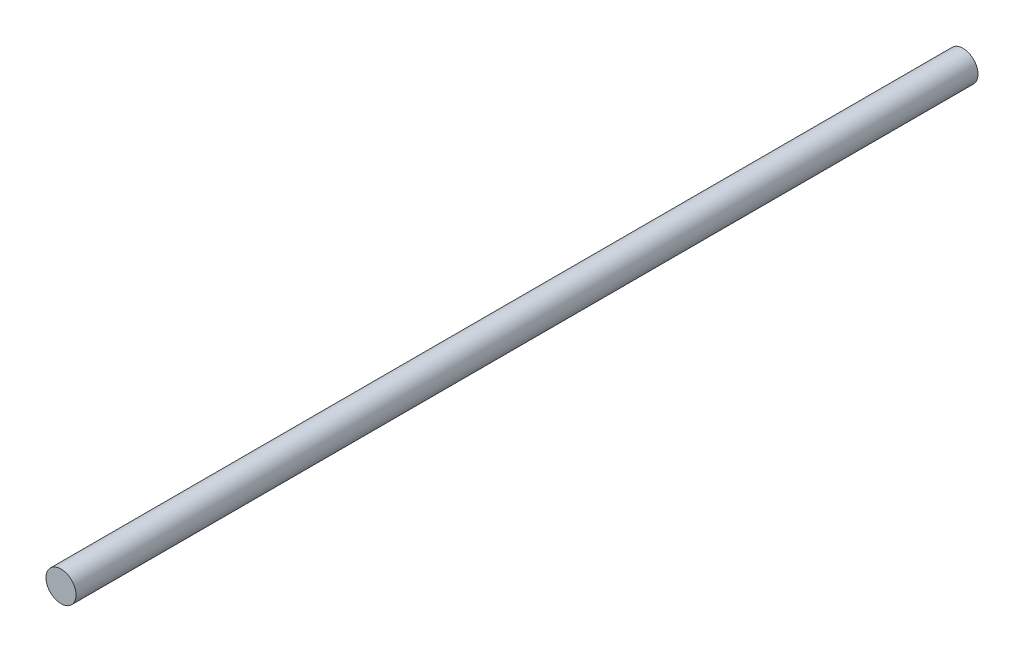
ISO-10303-21;
HEADER;
FILE_DESCRIPTION(('STEP AP214'),'2;1');
FILE_NAME('part.step','',(''),(''),'','','');
FILE_SCHEMA(('AUTOMOTIVE_DESIGN { 1 0 10303 214 1 1 1 1 }'));
ENDSEC;
DATA;
#1=APPLICATION_CONTEXT('core data for automotive mechanical design processes');
#2=APPLICATION_PROTOCOL_DEFINITION('international standard','automotive_design',2000,#1);
#3=PRODUCT_CONTEXT('',#1,'mechanical');
#4=PRODUCT('Part','Part','',(#3));
#5=PRODUCT_RELATED_PRODUCT_CATEGORY('part','',(#4));
#6=PRODUCT_DEFINITION_FORMATION('','',#4);
#7=PRODUCT_DEFINITION_CONTEXT('part definition',#1,'design');
#8=PRODUCT_DEFINITION('design','',#6,#7);
#9=PRODUCT_DEFINITION_SHAPE('','',#8);
#10=(LENGTH_UNIT() NAMED_UNIT(*) SI_UNIT(.MILLI.,.METRE.));
#11=(NAMED_UNIT(*) PLANE_ANGLE_UNIT() SI_UNIT($,.RADIAN.));
#12=(NAMED_UNIT(*) SI_UNIT($,.STERADIAN.) SOLID_ANGLE_UNIT());
#13=UNCERTAINTY_MEASURE_WITH_UNIT(LENGTH_MEASURE(1.E-05),#10,'distance_accuracy_value','');
#14=(GEOMETRIC_REPRESENTATION_CONTEXT(3) GLOBAL_UNCERTAINTY_ASSIGNED_CONTEXT((#13)) GLOBAL_UNIT_ASSIGNED_CONTEXT((#10,
#11,#12)) REPRESENTATION_CONTEXT('',''));
#15=CARTESIAN_POINT('',(0.,0.,0.));
#16=DIRECTION('',(0.,0.,1.));
#17=DIRECTION('',(1.,0.,0.));
#18=AXIS2_PLACEMENT_3D('',#15,#16,#17);
#19=CARTESIAN_POINT('',(0.,0.,1200.));
#20=DIRECTION('',(0.,0.,-1.));
#21=DIRECTION('',(-1.,0.,0.));
#22=AXIS2_PLACEMENT_3D('',#19,#20,#21);
#23=CYLINDRICAL_SURFACE('',#22,20.);
#24=CARTESIAN_POINT('',(0.,0.,1200.));
#25=DIRECTION('',(0.,0.,1.));
#26=DIRECTION('',(1.,0.,0.));
#27=AXIS2_PLACEMENT_3D('',#24,#25,#26);
#28=CIRCLE('',#27,20.);
#29=CARTESIAN_POINT('',(20.,0.,1200.));
#30=VERTEX_POINT('',#29);
#31=EDGE_CURVE('E10',#30,#30,#28,.T.);
#32=ORIENTED_EDGE('',*,*,#31,.F.);
#33=EDGE_LOOP('',(#32));
#34=FACE_BOUND('',#33,.T.);
#35=CARTESIAN_POINT('',(0.,0.,0.));
#36=DIRECTION('',(0.,0.,1.));
#37=DIRECTION('',(1.,0.,0.));
#38=AXIS2_PLACEMENT_3D('',#35,#36,#37);
#39=CIRCLE('',#38,20.);
#40=CARTESIAN_POINT('',(20.,0.,0.));
#41=VERTEX_POINT('',#40);
#42=EDGE_CURVE('E40',#41,#41,#39,.T.);
#43=ORIENTED_EDGE('',*,*,#42,.T.);
#44=EDGE_LOOP('',(#43));
#45=FACE_BOUND('',#44,.T.);
#46=ADVANCED_FACE('F37',(#34,#45),#23,.T.);
#47=CARTESIAN_POINT('',(0.,0.,1200.));
#48=DIRECTION('',(0.,0.,1.));
#49=DIRECTION('',(1.,0.,0.));
#50=AXIS2_PLACEMENT_3D('',#47,#48,#49);
#51=PLANE('',#50);
#52=ORIENTED_EDGE('',*,*,#31,.T.);
#53=EDGE_LOOP('',(#52));
#54=FACE_BOUND('',#53,.T.);
#55=ADVANCED_FACE('F52',(#54),#51,.T.);
#56=CARTESIAN_POINT('',(0.,0.,0.));
#57=DIRECTION('',(0.,0.,1.));
#58=DIRECTION('',(1.,0.,0.));
#59=AXIS2_PLACEMENT_3D('',#56,#57,#58);
#60=PLANE('',#59);
#61=ORIENTED_EDGE('',*,*,#42,.F.);
#62=EDGE_LOOP('',(#61));
#63=FACE_BOUND('',#62,.T.);
#64=ADVANCED_FACE('F50',(#63),#60,.F.);
#65=CLOSED_SHELL('',(#46,#55,#64));
#66=MANIFOLD_SOLID_BREP('B2',#65);
#67=ADVANCED_BREP_SHAPE_REPRESENTATION('',(#18,#66),#14);
#68=SHAPE_DEFINITION_REPRESENTATION(#9,#67);
ENDSEC;
END-ISO-10303-21;
